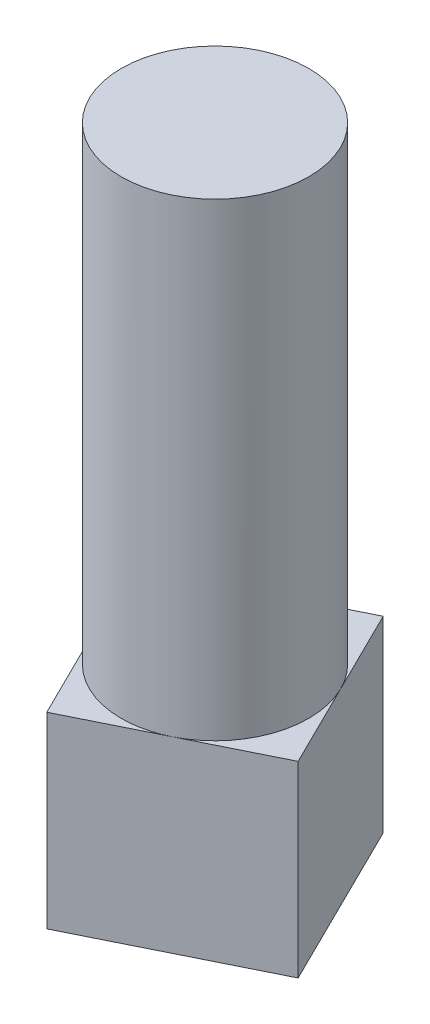
ISO-10303-21;
HEADER;
FILE_DESCRIPTION(('STEP AP214'),'2;1');
FILE_NAME('part.step','',(''),(''),'','','');
FILE_SCHEMA(('AUTOMOTIVE_DESIGN { 1 0 10303 214 1 1 1 1 }'));
ENDSEC;
DATA;
#1=APPLICATION_CONTEXT('core data for automotive mechanical design processes');
#2=APPLICATION_PROTOCOL_DEFINITION('international standard','automotive_design',2000,#1);
#3=PRODUCT_CONTEXT('',#1,'mechanical');
#4=PRODUCT('Part','Part','',(#3));
#5=PRODUCT_RELATED_PRODUCT_CATEGORY('part','',(#4));
#6=PRODUCT_DEFINITION_FORMATION('','',#4);
#7=PRODUCT_DEFINITION_CONTEXT('part definition',#1,'design');
#8=PRODUCT_DEFINITION('design','',#6,#7);
#9=PRODUCT_DEFINITION_SHAPE('','',#8);
#10=(LENGTH_UNIT() NAMED_UNIT(*) SI_UNIT(.MILLI.,.METRE.));
#11=(NAMED_UNIT(*) PLANE_ANGLE_UNIT() SI_UNIT($,.RADIAN.));
#12=(NAMED_UNIT(*) SI_UNIT($,.STERADIAN.) SOLID_ANGLE_UNIT());
#13=UNCERTAINTY_MEASURE_WITH_UNIT(LENGTH_MEASURE(1.E-05),#10,'distance_accuracy_value','');
#14=(GEOMETRIC_REPRESENTATION_CONTEXT(3) GLOBAL_UNCERTAINTY_ASSIGNED_CONTEXT((#13)) GLOBAL_UNIT_ASSIGNED_CONTEXT((#10,
#11,#12)) REPRESENTATION_CONTEXT('',''));
#15=CARTESIAN_POINT('',(0.,0.,0.));
#16=DIRECTION('',(0.,0.,1.));
#17=DIRECTION('',(1.,0.,0.));
#18=AXIS2_PLACEMENT_3D('',#15,#16,#17);
#19=CARTESIAN_POINT('',(0.,0.,0.));
#20=DIRECTION('',(0.,1.,0.));
#21=DIRECTION('',(0.,0.,1.));
#22=AXIS2_PLACEMENT_3D('',#19,#20,#21);
#23=PLANE('',#22);
#24=CARTESIAN_POINT('',(68.1169302318838,0.,2.00000000000004));
#25=DIRECTION('',(0.,1.,0.));
#26=DIRECTION('',(0.,0.,1.));
#27=AXIS2_PLACEMENT_3D('',#24,#25,#26);
#28=CIRCLE('',#27,2.);
#29=CARTESIAN_POINT('',(68.1169302318838,0.,4.00000000000004));
#30=VERTEX_POINT('',#29);
#31=EDGE_CURVE('E43',#30,#30,#28,.F.);
#32=ORIENTED_EDGE('',*,*,#31,.F.);
#33=EDGE_LOOP('',(#32));
#34=FACE_BOUND('',#33,.T.);
#35=ADVANCED_FACE('F39',(#34),#23,.T.);
#36=CARTESIAN_POINT('',(68.1169302318838,-10.,2.00000000000004));
#37=DIRECTION('',(0.,1.,0.));
#38=DIRECTION('',(0.,0.,1.));
#39=AXIS2_PLACEMENT_3D('',#36,#37,#38);
#40=CYLINDRICAL_SURFACE('',#39,2.);
#41=CARTESIAN_POINT('',(68.1169302318838,-10.,2.00000000000004));
#42=DIRECTION('',(0.,1.,0.));
#43=DIRECTION('',(0.,0.,1.));
#44=AXIS2_PLACEMENT_3D('',#41,#42,#43);
#45=CIRCLE('',#44,2.);
#46=CARTESIAN_POINT('',(66.3239239524881,-10.,2.88607476098103));
#47=VERTEX_POINT('',#46);
#48=CARTESIAN_POINT('',(67.2308554709027,-10.,0.206993720604319));
#49=VERTEX_POINT('',#48);
#50=EDGE_CURVE('E12',#47,#49,#45,.F.);
#51=ORIENTED_EDGE('',*,*,#50,.F.);
#52=CARTESIAN_POINT('',(69.0030049928648,-10.,3.79300627939573));
#53=VERTEX_POINT('',#52);
#54=EDGE_CURVE('E49',#53,#47,#45,.F.);
#55=ORIENTED_EDGE('',*,*,#54,.F.);
#56=CARTESIAN_POINT('',(69.9099365112795,-10.,1.11392523901899));
#57=VERTEX_POINT('',#56);
#58=EDGE_CURVE('E59',#57,#53,#45,.F.);
#59=ORIENTED_EDGE('',*,*,#58,.F.);
#60=EDGE_CURVE('E48',#49,#57,#45,.F.);
#61=ORIENTED_EDGE('',*,*,#60,.F.);
#62=EDGE_LOOP('',(#51,#55,#59,#61));
#63=FACE_BOUND('',#62,.T.);
#64=ORIENTED_EDGE('',*,*,#31,.T.);
#65=EDGE_LOOP('',(#64));
#66=FACE_BOUND('',#65,.T.);
#67=ADVANCED_FACE('F41',(#63,#66),#40,.T.);
#68=CARTESIAN_POINT('',(0.,-10.,0.));
#69=DIRECTION('',(0.,1.,0.));
#70=DIRECTION('',(0.,0.,1.));
#71=AXIS2_PLACEMENT_3D('',#68,#69,#70);
#72=PLANE('',#71);
#73=DIRECTION('',(-0.443037380490508,0.,-0.896503139697854));
#74=VECTOR('',#73,1.);
#75=CARTESIAN_POINT('',(52.1594196385869,-10.,-25.7763432399946));
#76=LINE('',#75,#74);
#77=CARTESIAN_POINT('',(65.4378491915071,-10.,1.0930684815853));
#78=VERTEX_POINT('',#77);
#79=EDGE_CURVE('E121',#47,#78,#76,.T.);
#80=ORIENTED_EDGE('',*,*,#79,.F.);
#81=ORIENTED_EDGE('',*,*,#50,.T.);
#82=DIRECTION('',(0.896503139697854,0.,-0.443037380490507));
#83=VECTOR('',#82,1.);
#84=CARTESIAN_POINT('',(13.2784295529201,-10.,26.8694117215799));
#85=LINE('',#84,#83);
#86=EDGE_CURVE('E133',#78,#49,#85,.T.);
#87=ORIENTED_EDGE('',*,*,#86,.F.);
#88=EDGE_LOOP('',(#80,#81,#87));
#89=FACE_BOUND('',#88,.T.);
#90=ADVANCED_FACE('F156',(#89),#72,.T.);
#91=CARTESIAN_POINT('',(69.0238617502985,-10.,-0.679081040376738));
#92=VERTEX_POINT('',#91);
#93=EDGE_CURVE('E132',#49,#92,#85,.T.);
#94=ORIENTED_EDGE('',*,*,#93,.F.);
#95=ORIENTED_EDGE('',*,*,#60,.T.);
#96=DIRECTION('',(-0.443037380490508,0.,-0.896503139697854));
#97=VECTOR('',#96,1.);
#98=CARTESIAN_POINT('',(55.7454321973783,-10.,-27.5484927619566));
#99=LINE('',#98,#97);
#100=EDGE_CURVE('E129',#57,#92,#99,.T.);
#101=ORIENTED_EDGE('',*,*,#100,.T.);
#102=EDGE_LOOP('',(#94,#95,#101));
#103=FACE_BOUND('',#102,.T.);
#104=ADVANCED_FACE('F146',(#103),#72,.T.);
#105=CARTESIAN_POINT('',(70.7960112722605,-10.,2.90693151841467));
#106=VERTEX_POINT('',#105);
#107=EDGE_CURVE('E99',#106,#57,#99,.T.);
#108=ORIENTED_EDGE('',*,*,#107,.T.);
#109=ORIENTED_EDGE('',*,*,#58,.T.);
#110=DIRECTION('',(0.89650313969785,0.,-0.443037380490514));
#111=VECTOR('',#110,1.);
#112=CARTESIAN_POINT('',(15.0505790748826,-10.,30.4554242803716));
#113=LINE('',#112,#111);
#114=EDGE_CURVE('E130',#53,#106,#113,.T.);
#115=ORIENTED_EDGE('',*,*,#114,.T.);
#116=EDGE_LOOP('',(#108,#109,#115));
#117=FACE_BOUND('',#116,.T.);
#118=ADVANCED_FACE('F168',(#117),#72,.T.);
#119=CARTESIAN_POINT('',(15.0505790748826,-14.,30.4554242803716));
#120=DIRECTION('',(0.443037380490514,0.,0.89650313969785));
#121=DIRECTION('',(0.89650313969785,0.,-0.443037380490514));
#122=AXIS2_PLACEMENT_3D('',#119,#120,#121);
#123=PLANE('',#122);
#124=CARTESIAN_POINT('',(67.2099987134691,-10.,4.67908104037673));
#125=VERTEX_POINT('',#124);
#126=EDGE_CURVE('E126',#125,#53,#113,.T.);
#127=ORIENTED_EDGE('',*,*,#126,.F.);
#128=DIRECTION('',(0.,1.,0.));
#129=VECTOR('',#128,1.);
#130=CARTESIAN_POINT('',(67.2099987134691,-14.,4.67908104037673));
#131=LINE('',#130,#129);
#132=CARTESIAN_POINT('',(67.2099987134691,-14.,4.67908104037673));
#133=VERTEX_POINT('',#132);
#134=EDGE_CURVE('E116',#133,#125,#131,.T.);
#135=ORIENTED_EDGE('',*,*,#134,.F.);
#136=DIRECTION('',(0.89650313969785,0.,-0.443037380490514));
#137=VECTOR('',#136,1.);
#138=CARTESIAN_POINT('',(15.0505790748826,-14.,30.4554242803716));
#139=LINE('',#138,#137);
#140=CARTESIAN_POINT('',(70.7960112722605,-14.,2.90693151841467));
#141=VERTEX_POINT('',#140);
#142=EDGE_CURVE('E109',#133,#141,#139,.T.);
#143=ORIENTED_EDGE('',*,*,#142,.T.);
#144=DIRECTION('',(0.,1.,0.));
#145=VECTOR('',#144,1.);
#146=CARTESIAN_POINT('',(70.7960112722605,-14.,2.90693151841467));
#147=LINE('',#146,#145);
#148=EDGE_CURVE('E92',#141,#106,#147,.T.);
#149=ORIENTED_EDGE('',*,*,#148,.T.);
#150=ORIENTED_EDGE('',*,*,#114,.F.);
#151=EDGE_LOOP('',(#127,#135,#143,#149,#150));
#152=FACE_BOUND('',#151,.T.);
#153=ADVANCED_FACE('F115',(#152),#123,.T.);
#154=CARTESIAN_POINT('',(52.1594196385869,-14.,-25.7763432399946));
#155=DIRECTION('',(0.896503139697854,0.,-0.443037380490508));
#156=DIRECTION('',(-0.443037380490508,0.,-0.896503139697854));
#157=AXIS2_PLACEMENT_3D('',#154,#155,#156);
#158=PLANE('',#157);
#159=EDGE_CURVE('E118',#125,#47,#76,.T.);
#160=ORIENTED_EDGE('',*,*,#159,.T.);
#161=ORIENTED_EDGE('',*,*,#79,.T.);
#162=DIRECTION('',(0.,1.,0.));
#163=VECTOR('',#162,1.);
#164=CARTESIAN_POINT('',(65.4378491915071,-14.,1.0930684815853));
#165=LINE('',#164,#163);
#166=CARTESIAN_POINT('',(65.4378491915071,-14.,1.0930684815853));
#167=VERTEX_POINT('',#166);
#168=EDGE_CURVE('E137',#167,#78,#165,.T.);
#169=ORIENTED_EDGE('',*,*,#168,.F.);
#170=DIRECTION('',(-0.443037380490508,0.,-0.896503139697854));
#171=VECTOR('',#170,1.);
#172=CARTESIAN_POINT('',(52.1594196385869,-14.,-25.7763432399946));
#173=LINE('',#172,#171);
#174=EDGE_CURVE('E104',#133,#167,#173,.T.);
#175=ORIENTED_EDGE('',*,*,#174,.F.);
#176=ORIENTED_EDGE('',*,*,#134,.T.);
#177=EDGE_LOOP('',(#160,#161,#169,#175,#176));
#178=FACE_BOUND('',#177,.T.);
#179=ADVANCED_FACE('F179',(#178),#158,.F.);
#180=CARTESIAN_POINT('',(13.2784295529201,-14.,26.8694117215799));
#181=DIRECTION('',(0.443037380490507,0.,0.896503139697854));
#182=DIRECTION('',(0.896503139697854,0.,-0.443037380490507));
#183=AXIS2_PLACEMENT_3D('',#180,#181,#182);
#184=PLANE('',#183);
#185=ORIENTED_EDGE('',*,*,#86,.T.);
#186=ORIENTED_EDGE('',*,*,#93,.T.);
#187=DIRECTION('',(0.,1.,0.));
#188=VECTOR('',#187,1.);
#189=CARTESIAN_POINT('',(69.0238617502985,-14.,-0.679081040376738));
#190=LINE('',#189,#188);
#191=CARTESIAN_POINT('',(69.0238617502985,-14.,-0.679081040376738));
#192=VERTEX_POINT('',#191);
#193=EDGE_CURVE('E103',#192,#92,#190,.T.);
#194=ORIENTED_EDGE('',*,*,#193,.F.);
#195=DIRECTION('',(0.896503139697854,0.,-0.443037380490507));
#196=VECTOR('',#195,1.);
#197=CARTESIAN_POINT('',(13.2784295529201,-14.,26.8694117215799));
#198=LINE('',#197,#196);
#199=EDGE_CURVE('E111',#167,#192,#198,.T.);
#200=ORIENTED_EDGE('',*,*,#199,.F.);
#201=ORIENTED_EDGE('',*,*,#168,.T.);
#202=EDGE_LOOP('',(#185,#186,#194,#200,#201));
#203=FACE_BOUND('',#202,.T.);
#204=ADVANCED_FACE('F142',(#203),#184,.F.);
#205=CARTESIAN_POINT('',(55.7454321973783,-14.,-27.5484927619566));
#206=DIRECTION('',(0.896503139697854,0.,-0.443037380490508));
#207=DIRECTION('',(-0.443037380490508,0.,-0.896503139697854));
#208=AXIS2_PLACEMENT_3D('',#205,#206,#207);
#209=PLANE('',#208);
#210=ORIENTED_EDGE('',*,*,#107,.F.);
#211=ORIENTED_EDGE('',*,*,#148,.F.);
#212=DIRECTION('',(-0.443037380490508,0.,-0.896503139697854));
#213=VECTOR('',#212,1.);
#214=CARTESIAN_POINT('',(55.7454321973783,-14.,-27.5484927619566));
#215=LINE('',#214,#213);
#216=EDGE_CURVE('E96',#141,#192,#215,.T.);
#217=ORIENTED_EDGE('',*,*,#216,.T.);
#218=ORIENTED_EDGE('',*,*,#193,.T.);
#219=ORIENTED_EDGE('',*,*,#100,.F.);
#220=EDGE_LOOP('',(#210,#211,#217,#218,#219));
#221=FACE_BOUND('',#220,.T.);
#222=ADVANCED_FACE('F94',(#221),#209,.T.);
#223=CARTESIAN_POINT('',(0.,-14.,0.));
#224=DIRECTION('',(0.,1.,0.));
#225=DIRECTION('',(0.,0.,1.));
#226=AXIS2_PLACEMENT_3D('',#223,#224,#225);
#227=PLANE('',#226);
#228=ORIENTED_EDGE('',*,*,#142,.F.);
#229=ORIENTED_EDGE('',*,*,#174,.T.);
#230=ORIENTED_EDGE('',*,*,#199,.T.);
#231=ORIENTED_EDGE('',*,*,#216,.F.);
#232=EDGE_LOOP('',(#228,#229,#230,#231));
#233=FACE_BOUND('',#232,.T.);
#234=ADVANCED_FACE('F108',(#233),#227,.F.);
#235=ORIENTED_EDGE('',*,*,#126,.T.);
#236=ORIENTED_EDGE('',*,*,#54,.T.);
#237=ORIENTED_EDGE('',*,*,#159,.F.);
#238=EDGE_LOOP('',(#235,#236,#237));
#239=FACE_BOUND('',#238,.T.);
#240=ADVANCED_FACE('F164',(#239),#72,.T.);
#241=CLOSED_SHELL('',(#35,#67,#90,#104,#118,#153,#179,#204,#222,#234,#240));
#242=MANIFOLD_SOLID_BREP('B2',#241);
#243=ADVANCED_BREP_SHAPE_REPRESENTATION('',(#18,#242),#14);
#244=SHAPE_DEFINITION_REPRESENTATION(#9,#243);
ENDSEC;
END-ISO-10303-21;
